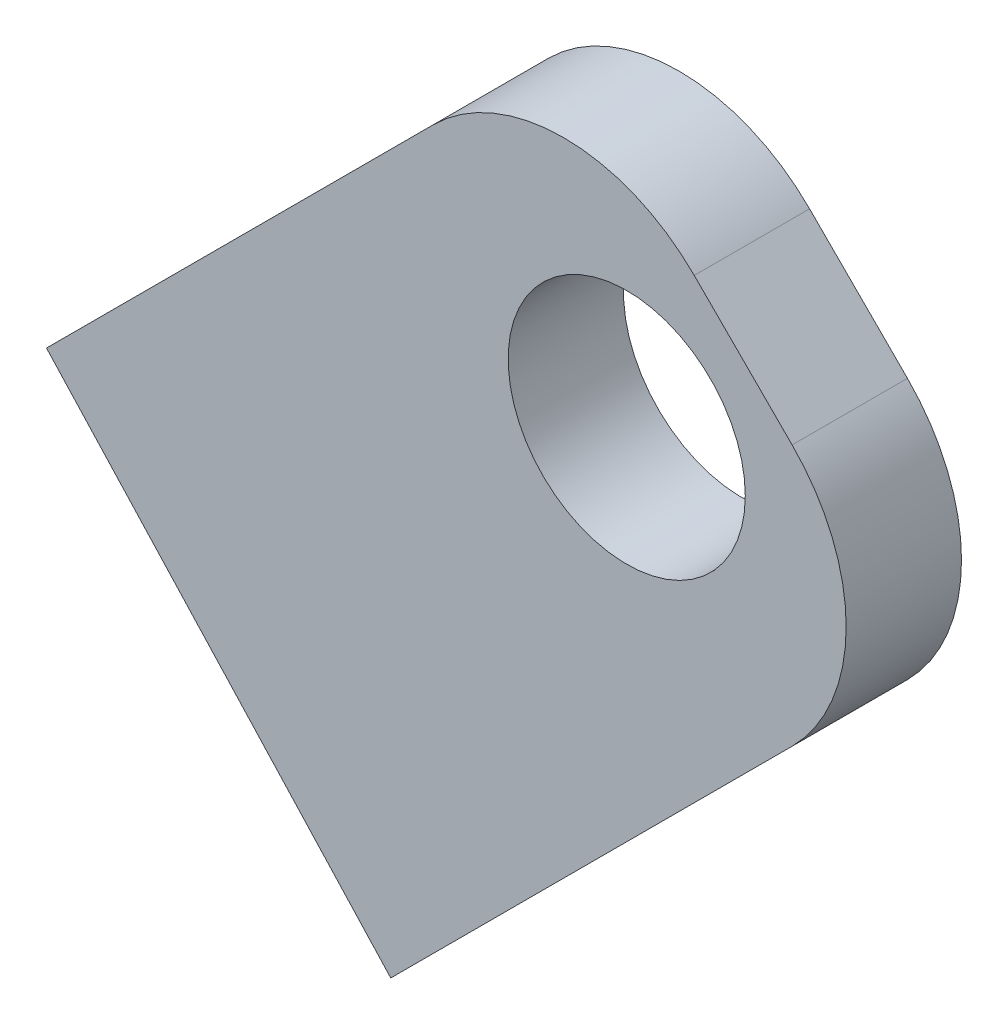
ISO-10303-21;
HEADER;
FILE_DESCRIPTION(('STEP AP214'),'2;1');
FILE_NAME('part.step','',(''),(''),'','','');
FILE_SCHEMA(('AUTOMOTIVE_DESIGN { 1 0 10303 214 1 1 1 1 }'));
ENDSEC;
DATA;
#1=APPLICATION_CONTEXT('core data for automotive mechanical design processes');
#2=APPLICATION_PROTOCOL_DEFINITION('international standard','automotive_design',2000,#1);
#3=PRODUCT_CONTEXT('',#1,'mechanical');
#4=PRODUCT('Part','Part','',(#3));
#5=PRODUCT_RELATED_PRODUCT_CATEGORY('part','',(#4));
#6=PRODUCT_DEFINITION_FORMATION('','',#4);
#7=PRODUCT_DEFINITION_CONTEXT('part definition',#1,'design');
#8=PRODUCT_DEFINITION('design','',#6,#7);
#9=PRODUCT_DEFINITION_SHAPE('','',#8);
#10=(LENGTH_UNIT() NAMED_UNIT(*) SI_UNIT(.MILLI.,.METRE.));
#11=(NAMED_UNIT(*) PLANE_ANGLE_UNIT() SI_UNIT($,.RADIAN.));
#12=(NAMED_UNIT(*) SI_UNIT($,.STERADIAN.) SOLID_ANGLE_UNIT());
#13=UNCERTAINTY_MEASURE_WITH_UNIT(LENGTH_MEASURE(1.E-05),#10,'distance_accuracy_value','');
#14=(GEOMETRIC_REPRESENTATION_CONTEXT(3) GLOBAL_UNCERTAINTY_ASSIGNED_CONTEXT((#13)) GLOBAL_UNIT_ASSIGNED_CONTEXT((#10,
#11,#12)) REPRESENTATION_CONTEXT('',''));
#15=CARTESIAN_POINT('',(0.,0.,0.));
#16=DIRECTION('',(0.,0.,1.));
#17=DIRECTION('',(1.,0.,0.));
#18=AXIS2_PLACEMENT_3D('',#15,#16,#17);
#19=CARTESIAN_POINT('',(5.92682582235016,3.43373589392121,3.175));
#20=DIRECTION('',(0.,0.,1.));
#21=DIRECTION('',(1.,0.,0.));
#22=AXIS2_PLACEMENT_3D('',#19,#20,#21);
#23=PLANE('',#22);
#24=DIRECTION('',(0.677771779812042,-0.735272340354523,0.));
#25=VECTOR('',#24,1.);
#26=CARTESIAN_POINT('',(-11.00682582235,-0.927557181282165,3.175));
#27=LINE('',#26,#25);
#28=CARTESIAN_POINT('',(-11.00682582235,-0.927557181282165,3.175));
#29=VERTEX_POINT('',#28);
#30=CARTESIAN_POINT('',(-1.53051790495773,-11.207812730242,3.175));
#31=VERTEX_POINT('',#30);
#32=EDGE_CURVE('E152',#29,#31,#27,.T.);
#33=ORIENTED_EDGE('',*,*,#32,.T.);
#34=DIRECTION('',(0.707106781186544,0.707106781186551,0.));
#35=VECTOR('',#34,1.);
#36=CARTESIAN_POINT('',(-1.53051790495773,-11.207812730242,3.175));
#37=LINE('',#36,#35);
#38=CARTESIAN_POINT('',(9.51892827077777,-0.158366554506406,3.175));
#39=VERTEX_POINT('',#38);
#40=EDGE_CURVE('E100',#31,#39,#37,.T.);
#41=ORIENTED_EDGE('',*,*,#40,.T.);
#42=CARTESIAN_POINT('',(5.92682582235016,3.43373589392121,3.175));
#43=DIRECTION('',(0.,0.,1.));
#44=DIRECTION('',(1.,0.,0.));
#45=AXIS2_PLACEMENT_3D('',#42,#43,#44);
#46=CIRCLE('',#45,5.07999999999997);
#47=CARTESIAN_POINT('',(9.5189282707778,7.02583834234885,3.175));
#48=VERTEX_POINT('',#47);
#49=EDGE_CURVE('E113',#39,#48,#46,.T.);
#50=ORIENTED_EDGE('',*,*,#49,.T.);
#51=DIRECTION('',(-0.707106781186549,0.707106781186546,0.));
#52=VECTOR('',#51,1.);
#53=CARTESIAN_POINT('',(9.51892827077783,7.02583834234888,3.175));
#54=LINE('',#53,#52);
#55=CARTESIAN_POINT('',(6.82485143445705,9.71991517866964,3.175));
#56=VERTEX_POINT('',#55);
#57=EDGE_CURVE('E107',#48,#56,#54,.T.);
#58=ORIENTED_EDGE('',*,*,#57,.T.);
#59=CARTESIAN_POINT('',(3.23274898602938,6.12781273024197,3.175));
#60=DIRECTION('',(0.,0.,1.));
#61=DIRECTION('',(1.,0.,0.));
#62=AXIS2_PLACEMENT_3D('',#59,#60,#61);
#63=CIRCLE('',#62,5.07999999999998);
#64=CARTESIAN_POINT('',(-0.359353462398257,9.71991517866964,3.175));
#65=VERTEX_POINT('',#64);
#66=EDGE_CURVE('E111',#56,#65,#63,.T.);
#67=ORIENTED_EDGE('',*,*,#66,.T.);
#68=DIRECTION('',(-0.707106781186548,-0.707106781186548,0.));
#69=VECTOR('',#68,1.);
#70=CARTESIAN_POINT('',(-0.359353462398238,9.71991517866962,3.175));
#71=LINE('',#70,#69);
#72=EDGE_CURVE('E63',#65,#29,#71,.T.);
#73=ORIENTED_EDGE('',*,*,#72,.T.);
#74=EDGE_LOOP('',(#33,#41,#50,#58,#67,#73));
#75=FACE_BOUND('',#74,.T.);
#76=CARTESIAN_POINT('',(4.96593841739573,5.16692532528755,3.175));
#77=DIRECTION('',(0.,0.,1.));
#78=DIRECTION('',(1.,0.,0.));
#79=AXIS2_PLACEMENT_3D('',#76,#77,#78);
#80=CIRCLE('',#79,3.26390000000001);
#81=CARTESIAN_POINT('',(8.22983841739574,5.16692532528755,3.175));
#82=VERTEX_POINT('',#81);
#83=EDGE_CURVE('E140',#82,#82,#80,.T.);
#84=ORIENTED_EDGE('',*,*,#83,.F.);
#85=EDGE_LOOP('',(#84));
#86=FACE_BOUND('',#85,.T.);
#87=ADVANCED_FACE('F45',(#75,#86),#23,.T.);
#88=CARTESIAN_POINT('',(5.92682582235016,3.43373589392121,0.));
#89=DIRECTION('',(0.,0.,1.));
#90=DIRECTION('',(1.,0.,0.));
#91=AXIS2_PLACEMENT_3D('',#88,#89,#90);
#92=PLANE('',#91);
#93=DIRECTION('',(0.677771779812042,-0.735272340354523,0.));
#94=VECTOR('',#93,1.);
#95=CARTESIAN_POINT('',(-11.00682582235,-0.927557181282165,0.));
#96=LINE('',#95,#94);
#97=CARTESIAN_POINT('',(-11.00682582235,-0.927557181282165,0.));
#98=VERTEX_POINT('',#97);
#99=CARTESIAN_POINT('',(-1.53051790495773,-11.207812730242,0.));
#100=VERTEX_POINT('',#99);
#101=EDGE_CURVE('E135',#98,#100,#96,.T.);
#102=ORIENTED_EDGE('',*,*,#101,.F.);
#103=DIRECTION('',(-0.707106781186548,-0.707106781186548,0.));
#104=VECTOR('',#103,1.);
#105=CARTESIAN_POINT('',(-0.359353462398238,9.71991517866962,0.));
#106=LINE('',#105,#104);
#107=CARTESIAN_POINT('',(-0.359353462398257,9.71991517866964,0.));
#108=VERTEX_POINT('',#107);
#109=EDGE_CURVE('E92',#108,#98,#106,.T.);
#110=ORIENTED_EDGE('',*,*,#109,.F.);
#111=CARTESIAN_POINT('',(3.23274898602938,6.12781273024197,0.));
#112=DIRECTION('',(0.,0.,1.));
#113=DIRECTION('',(1.,0.,0.));
#114=AXIS2_PLACEMENT_3D('',#111,#112,#113);
#115=CIRCLE('',#114,5.07999999999998);
#116=CARTESIAN_POINT('',(6.82485143445705,9.71991517866964,0.));
#117=VERTEX_POINT('',#116);
#118=EDGE_CURVE('E86',#117,#108,#115,.T.);
#119=ORIENTED_EDGE('',*,*,#118,.F.);
#120=DIRECTION('',(-0.707106781186549,0.707106781186546,0.));
#121=VECTOR('',#120,1.);
#122=CARTESIAN_POINT('',(9.51892827077783,7.02583834234888,0.));
#123=LINE('',#122,#121);
#124=CARTESIAN_POINT('',(9.5189282707778,7.02583834234885,0.));
#125=VERTEX_POINT('',#124);
#126=EDGE_CURVE('E122',#125,#117,#123,.T.);
#127=ORIENTED_EDGE('',*,*,#126,.F.);
#128=CARTESIAN_POINT('',(5.92682582235016,3.43373589392121,0.));
#129=DIRECTION('',(0.,0.,1.));
#130=DIRECTION('',(1.,0.,0.));
#131=AXIS2_PLACEMENT_3D('',#128,#129,#130);
#132=CIRCLE('',#131,5.07999999999997);
#133=CARTESIAN_POINT('',(9.51892827077777,-0.158366554506406,0.));
#134=VERTEX_POINT('',#133);
#135=EDGE_CURVE('E143',#134,#125,#132,.T.);
#136=ORIENTED_EDGE('',*,*,#135,.F.);
#137=DIRECTION('',(0.707106781186544,0.707106781186551,0.));
#138=VECTOR('',#137,1.);
#139=CARTESIAN_POINT('',(-1.53051790495773,-11.207812730242,0.));
#140=LINE('',#139,#138);
#141=EDGE_CURVE('E139',#100,#134,#140,.T.);
#142=ORIENTED_EDGE('',*,*,#141,.F.);
#143=EDGE_LOOP('',(#102,#110,#119,#127,#136,#142));
#144=FACE_BOUND('',#143,.T.);
#145=CARTESIAN_POINT('',(4.96593841739573,5.16692532528755,0.));
#146=DIRECTION('',(0.,0.,1.));
#147=DIRECTION('',(1.,0.,0.));
#148=AXIS2_PLACEMENT_3D('',#145,#146,#147);
#149=CIRCLE('',#148,3.26390000000001);
#150=CARTESIAN_POINT('',(8.22983841739574,5.16692532528755,0.));
#151=VERTEX_POINT('',#150);
#152=EDGE_CURVE('E249',#151,#151,#149,.T.);
#153=ORIENTED_EDGE('',*,*,#152,.T.);
#154=EDGE_LOOP('',(#153));
#155=FACE_BOUND('',#154,.T.);
#156=ADVANCED_FACE('F165',(#144,#155),#92,.F.);
#157=CARTESIAN_POINT('',(-11.00682582235,-0.927557181282165,3.175));
#158=DIRECTION('',(0.735272340354523,0.677771779812042,0.));
#159=DIRECTION('',(-0.677771779812042,0.735272340354523,0.));
#160=AXIS2_PLACEMENT_3D('',#157,#158,#159);
#161=PLANE('',#160);
#162=ORIENTED_EDGE('',*,*,#101,.T.);
#163=DIRECTION('',(0.,0.,-1.));
#164=VECTOR('',#163,1.);
#165=CARTESIAN_POINT('',(-1.53051790495773,-11.207812730242,3.175));
#166=LINE('',#165,#164);
#167=EDGE_CURVE('E11',#31,#100,#166,.T.);
#168=ORIENTED_EDGE('',*,*,#167,.F.);
#169=ORIENTED_EDGE('',*,*,#32,.F.);
#170=DIRECTION('',(0.,0.,-1.));
#171=VECTOR('',#170,1.);
#172=CARTESIAN_POINT('',(-11.00682582235,-0.927557181282165,3.175));
#173=LINE('',#172,#171);
#174=EDGE_CURVE('E131',#29,#98,#173,.T.);
#175=ORIENTED_EDGE('',*,*,#174,.T.);
#176=EDGE_LOOP('',(#162,#168,#169,#175));
#177=FACE_BOUND('',#176,.T.);
#178=ADVANCED_FACE('F47',(#177),#161,.F.);
#179=CARTESIAN_POINT('',(-1.53051790495773,-11.207812730242,3.175));
#180=DIRECTION('',(-0.707106781186551,0.707106781186544,0.));
#181=DIRECTION('',(-0.707106781186544,-0.707106781186551,0.));
#182=AXIS2_PLACEMENT_3D('',#179,#180,#181);
#183=PLANE('',#182);
#184=ORIENTED_EDGE('',*,*,#141,.T.);
#185=DIRECTION('',(0.,0.,-1.));
#186=VECTOR('',#185,1.);
#187=CARTESIAN_POINT('',(9.51892827077777,-0.158366554506406,3.175));
#188=LINE('',#187,#186);
#189=EDGE_CURVE('E55',#39,#134,#188,.T.);
#190=ORIENTED_EDGE('',*,*,#189,.F.);
#191=ORIENTED_EDGE('',*,*,#40,.F.);
#192=ORIENTED_EDGE('',*,*,#167,.T.);
#193=EDGE_LOOP('',(#184,#190,#191,#192));
#194=FACE_BOUND('',#193,.T.);
#195=ADVANCED_FACE('F190',(#194),#183,.F.);
#196=CARTESIAN_POINT('',(5.92682582235016,3.43373589392121,3.175));
#197=DIRECTION('',(0.,0.,-1.));
#198=DIRECTION('',(-1.,0.,0.));
#199=AXIS2_PLACEMENT_3D('',#196,#197,#198);
#200=CYLINDRICAL_SURFACE('',#199,5.07999999999997);
#201=ORIENTED_EDGE('',*,*,#135,.T.);
#202=DIRECTION('',(0.,0.,-1.));
#203=VECTOR('',#202,1.);
#204=CARTESIAN_POINT('',(9.5189282707778,7.02583834234885,3.175));
#205=LINE('',#204,#203);
#206=EDGE_CURVE('E124',#48,#125,#205,.T.);
#207=ORIENTED_EDGE('',*,*,#206,.F.);
#208=ORIENTED_EDGE('',*,*,#49,.F.);
#209=ORIENTED_EDGE('',*,*,#189,.T.);
#210=EDGE_LOOP('',(#201,#207,#208,#209));
#211=FACE_BOUND('',#210,.T.);
#212=ADVANCED_FACE('F162',(#211),#200,.T.);
#213=CARTESIAN_POINT('',(9.51892827077783,7.02583834234888,3.175));
#214=DIRECTION('',(-0.707106781186546,-0.707106781186549,0.));
#215=DIRECTION('',(0.707106781186549,-0.707106781186546,0.));
#216=AXIS2_PLACEMENT_3D('',#213,#214,#215);
#217=PLANE('',#216);
#218=ORIENTED_EDGE('',*,*,#126,.T.);
#219=DIRECTION('',(0.,0.,-1.));
#220=VECTOR('',#219,1.);
#221=CARTESIAN_POINT('',(6.82485143445705,9.71991517866964,3.175));
#222=LINE('',#221,#220);
#223=EDGE_CURVE('E119',#56,#117,#222,.T.);
#224=ORIENTED_EDGE('',*,*,#223,.F.);
#225=ORIENTED_EDGE('',*,*,#57,.F.);
#226=ORIENTED_EDGE('',*,*,#206,.T.);
#227=EDGE_LOOP('',(#218,#224,#225,#226));
#228=FACE_BOUND('',#227,.T.);
#229=ADVANCED_FACE('F120',(#228),#217,.F.);
#230=CARTESIAN_POINT('',(3.23274898602938,6.12781273024197,3.175));
#231=DIRECTION('',(0.,0.,-1.));
#232=DIRECTION('',(-1.,0.,0.));
#233=AXIS2_PLACEMENT_3D('',#230,#231,#232);
#234=CYLINDRICAL_SURFACE('',#233,5.07999999999998);
#235=ORIENTED_EDGE('',*,*,#118,.T.);
#236=DIRECTION('',(0.,0.,-1.));
#237=VECTOR('',#236,1.);
#238=CARTESIAN_POINT('',(-0.359353462398257,9.71991517866964,3.175));
#239=LINE('',#238,#237);
#240=EDGE_CURVE('E125',#65,#108,#239,.T.);
#241=ORIENTED_EDGE('',*,*,#240,.F.);
#242=ORIENTED_EDGE('',*,*,#66,.F.);
#243=ORIENTED_EDGE('',*,*,#223,.T.);
#244=EDGE_LOOP('',(#235,#241,#242,#243));
#245=FACE_BOUND('',#244,.T.);
#246=ADVANCED_FACE('F127',(#245),#234,.T.);
#247=CARTESIAN_POINT('',(-0.359353462398238,9.71991517866962,3.175));
#248=DIRECTION('',(0.707106781186548,-0.707106781186548,0.));
#249=DIRECTION('',(0.707106781186548,0.707106781186548,0.));
#250=AXIS2_PLACEMENT_3D('',#247,#248,#249);
#251=PLANE('',#250);
#252=ORIENTED_EDGE('',*,*,#109,.T.);
#253=ORIENTED_EDGE('',*,*,#174,.F.);
#254=ORIENTED_EDGE('',*,*,#72,.F.);
#255=ORIENTED_EDGE('',*,*,#240,.T.);
#256=EDGE_LOOP('',(#252,#253,#254,#255));
#257=FACE_BOUND('',#256,.T.);
#258=ADVANCED_FACE('F170',(#257),#251,.F.);
#259=CARTESIAN_POINT('',(4.96593841739573,5.16692532528755,3.175));
#260=DIRECTION('',(0.,0.,-1.));
#261=DIRECTION('',(-1.,0.,0.));
#262=AXIS2_PLACEMENT_3D('',#259,#260,#261);
#263=CYLINDRICAL_SURFACE('',#262,3.26390000000001);
#264=ORIENTED_EDGE('',*,*,#83,.T.);
#265=EDGE_LOOP('',(#264));
#266=FACE_BOUND('',#265,.T.);
#267=ORIENTED_EDGE('',*,*,#152,.F.);
#268=EDGE_LOOP('',(#267));
#269=FACE_BOUND('',#268,.T.);
#270=ADVANCED_FACE('F172',(#266,#269),#263,.F.);
#271=CLOSED_SHELL('',(#87,#156,#178,#195,#212,#229,#246,#258,#270));
#272=MANIFOLD_SOLID_BREP('B2',#271);
#273=ADVANCED_BREP_SHAPE_REPRESENTATION('',(#18,#272),#14);
#274=SHAPE_DEFINITION_REPRESENTATION(#9,#273);
ENDSEC;
END-ISO-10303-21;
